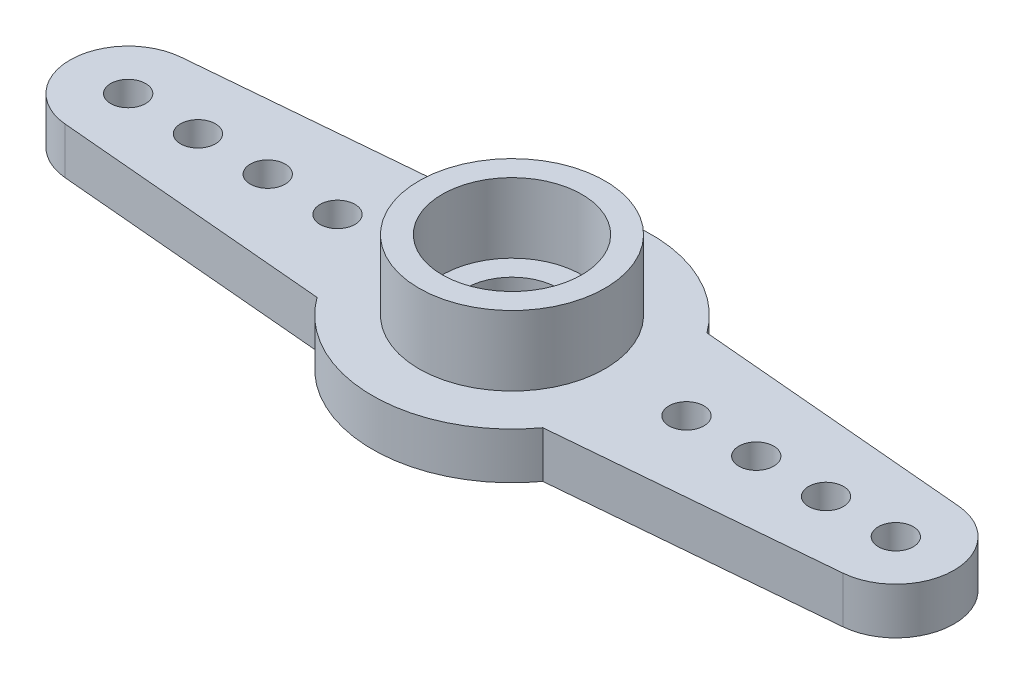
ISO-10303-21;
HEADER;
FILE_DESCRIPTION(('STEP AP214'),'2;1');
FILE_NAME('part.step','',(''),(''),'','','');
FILE_SCHEMA(('AUTOMOTIVE_DESIGN { 1 0 10303 214 1 1 1 1 }'));
ENDSEC;
DATA;
#1=APPLICATION_CONTEXT('core data for automotive mechanical design processes');
#2=APPLICATION_PROTOCOL_DEFINITION('international standard','automotive_design',2000,#1);
#3=PRODUCT_CONTEXT('',#1,'mechanical');
#4=PRODUCT('Part','Part','',(#3));
#5=PRODUCT_RELATED_PRODUCT_CATEGORY('part','',(#4));
#6=PRODUCT_DEFINITION_FORMATION('','',#4);
#7=PRODUCT_DEFINITION_CONTEXT('part definition',#1,'design');
#8=PRODUCT_DEFINITION('design','',#6,#7);
#9=PRODUCT_DEFINITION_SHAPE('','',#8);
#10=(LENGTH_UNIT() NAMED_UNIT(*) SI_UNIT(.MILLI.,.METRE.));
#11=(NAMED_UNIT(*) PLANE_ANGLE_UNIT() SI_UNIT($,.RADIAN.));
#12=(NAMED_UNIT(*) SI_UNIT($,.STERADIAN.) SOLID_ANGLE_UNIT());
#13=UNCERTAINTY_MEASURE_WITH_UNIT(LENGTH_MEASURE(1.E-05),#10,'distance_accuracy_value','');
#14=(GEOMETRIC_REPRESENTATION_CONTEXT(3) GLOBAL_UNCERTAINTY_ASSIGNED_CONTEXT((#13)) GLOBAL_UNIT_ASSIGNED_CONTEXT((#10,
#11,#12)) REPRESENTATION_CONTEXT('',''));
#15=CARTESIAN_POINT('',(0.,0.,0.));
#16=DIRECTION('',(0.,0.,1.));
#17=DIRECTION('',(1.,0.,0.));
#18=AXIS2_PLACEMENT_3D('',#15,#16,#17);
#19=CARTESIAN_POINT('',(16.5,2.,0.));
#20=DIRECTION('',(0.,1.,0.));
#21=DIRECTION('',(0.,0.,1.));
#22=AXIS2_PLACEMENT_3D('',#19,#20,#21);
#23=PLANE('',#22);
#24=CARTESIAN_POINT('',(0.,2.,0.));
#25=DIRECTION('',(0.,1.,0.));
#26=DIRECTION('',(0.,0.,1.));
#27=AXIS2_PLACEMENT_3D('',#24,#25,#26);
#28=CIRCLE('',#27,2.);
#29=CARTESIAN_POINT('',(0.,2.,2.));
#30=VERTEX_POINT('',#29);
#31=EDGE_CURVE('E142',#30,#30,#28,.T.);
#32=ORIENTED_EDGE('',*,*,#31,.F.);
#33=EDGE_LOOP('',(#32));
#34=FACE_BOUND('',#33,.T.);
#35=CARTESIAN_POINT('',(0.,2.,0.));
#36=DIRECTION('',(0.,1.,0.));
#37=DIRECTION('',(0.,0.,1.));
#38=AXIS2_PLACEMENT_3D('',#35,#36,#37);
#39=CIRCLE('',#38,3.);
#40=CARTESIAN_POINT('',(0.,2.,3.));
#41=VERTEX_POINT('',#40);
#42=EDGE_CURVE('E11',#41,#41,#39,.F.);
#43=ORIENTED_EDGE('',*,*,#42,.F.);
#44=EDGE_LOOP('',(#43));
#45=FACE_BOUND('',#44,.T.);
#46=ADVANCED_FACE('F39',(#34,#45),#23,.T.);
#47=CARTESIAN_POINT('',(0.,2.,0.));
#48=DIRECTION('',(0.,1.,0.));
#49=DIRECTION('',(0.,0.,1.));
#50=AXIS2_PLACEMENT_3D('',#47,#48,#49);
#51=CIRCLE('',#50,4.);
#52=CARTESIAN_POINT('',(0.,2.,4.));
#53=VERTEX_POINT('',#52);
#54=EDGE_CURVE('E245',#53,#53,#51,.T.);
#55=ORIENTED_EDGE('',*,*,#54,.F.);
#56=EDGE_LOOP('',(#55));
#57=FACE_BOUND('',#56,.T.);
#58=CARTESIAN_POINT('',(-10.5,2.,0.));
#59=DIRECTION('',(0.,1.,0.));
#60=DIRECTION('',(0.,0.,-1.));
#61=AXIS2_PLACEMENT_3D('',#58,#59,#60);
#62=CIRCLE('',#61,0.75);
#63=CARTESIAN_POINT('',(-10.5,2.,-0.75));
#64=VERTEX_POINT('',#63);
#65=EDGE_CURVE('E230',#64,#64,#62,.T.);
#66=ORIENTED_EDGE('',*,*,#65,.F.);
#67=EDGE_LOOP('',(#66));
#68=FACE_BOUND('',#67,.T.);
#69=CARTESIAN_POINT('',(-16.5,2.,0.));
#70=DIRECTION('',(0.,1.,0.));
#71=DIRECTION('',(0.,0.,-1.));
#72=AXIS2_PLACEMENT_3D('',#69,#70,#71);
#73=CIRCLE('',#72,0.750000000000002);
#74=CARTESIAN_POINT('',(-16.5,2.,-0.750000000000002));
#75=VERTEX_POINT('',#74);
#76=EDGE_CURVE('E218',#75,#75,#73,.T.);
#77=ORIENTED_EDGE('',*,*,#76,.F.);
#78=EDGE_LOOP('',(#77));
#79=FACE_BOUND('',#78,.T.);
#80=CARTESIAN_POINT('',(13.5,2.,0.));
#81=DIRECTION('',(0.,1.,0.));
#82=DIRECTION('',(0.,0.,1.));
#83=AXIS2_PLACEMENT_3D('',#80,#81,#82);
#84=CIRCLE('',#83,0.750000000000002);
#85=CARTESIAN_POINT('',(13.5,2.,0.750000000000002));
#86=VERTEX_POINT('',#85);
#87=EDGE_CURVE('E206',#86,#86,#84,.T.);
#88=ORIENTED_EDGE('',*,*,#87,.F.);
#89=EDGE_LOOP('',(#88));
#90=FACE_BOUND('',#89,.T.);
#91=CARTESIAN_POINT('',(7.5,2.,0.));
#92=DIRECTION('',(0.,1.,0.));
#93=DIRECTION('',(0.,0.,1.));
#94=AXIS2_PLACEMENT_3D('',#91,#92,#93);
#95=CIRCLE('',#94,0.75);
#96=CARTESIAN_POINT('',(7.5,2.,0.75));
#97=VERTEX_POINT('',#96);
#98=EDGE_CURVE('E194',#97,#97,#95,.T.);
#99=ORIENTED_EDGE('',*,*,#98,.F.);
#100=EDGE_LOOP('',(#99));
#101=FACE_BOUND('',#100,.T.);
#102=CARTESIAN_POINT('',(16.5,2.,0.));
#103=DIRECTION('',(0.,1.,0.));
#104=DIRECTION('',(0.,0.,1.));
#105=AXIS2_PLACEMENT_3D('',#102,#103,#104);
#106=CIRCLE('',#105,2.5);
#107=CARTESIAN_POINT('',(16.7178893568691,2.,2.49048674522937));
#108=VERTEX_POINT('',#107);
#109=CARTESIAN_POINT('',(16.7178893568691,2.,-2.49048674522936));
#110=VERTEX_POINT('',#109);
#111=EDGE_CURVE('E153',#108,#110,#106,.T.);
#112=ORIENTED_EDGE('',*,*,#111,.T.);
#113=DIRECTION('',(-0.996194698091746,0.,-0.0871557427476513));
#114=VECTOR('',#113,1.);
#115=CARTESIAN_POINT('',(16.7178893568691,2.,-2.49048674522936));
#116=LINE('',#115,#114);
#117=CARTESIAN_POINT('',(4.85276526325977,2.,-3.5285505947484));
#118=VERTEX_POINT('',#117);
#119=EDGE_CURVE('E100',#110,#118,#116,.T.);
#120=ORIENTED_EDGE('',*,*,#119,.T.);
#121=CARTESIAN_POINT('',(0.,2.,0.));
#122=DIRECTION('',(0.,1.,0.));
#123=DIRECTION('',(0.,0.,1.));
#124=AXIS2_PLACEMENT_3D('',#121,#122,#123);
#125=CIRCLE('',#124,6.);
#126=CARTESIAN_POINT('',(-4.85276526325977,2.,-3.5285505947484));
#127=VERTEX_POINT('',#126);
#128=EDGE_CURVE('E185',#118,#127,#125,.T.);
#129=ORIENTED_EDGE('',*,*,#128,.T.);
#130=DIRECTION('',(-0.996194698091746,0.,0.0871557427476513));
#131=VECTOR('',#130,1.);
#132=CARTESIAN_POINT('',(-16.7178893568691,2.,-2.49048674522936));
#133=LINE('',#132,#131);
#134=CARTESIAN_POINT('',(-16.7178893568691,2.,-2.49048674522936));
#135=VERTEX_POINT('',#134);
#136=EDGE_CURVE('E184',#127,#135,#133,.T.);
#137=ORIENTED_EDGE('',*,*,#136,.T.);
#138=CARTESIAN_POINT('',(-16.5,2.,0.));
#139=DIRECTION('',(0.,1.,0.));
#140=DIRECTION('',(0.,0.,-1.));
#141=AXIS2_PLACEMENT_3D('',#138,#139,#140);
#142=CIRCLE('',#141,2.5);
#143=CARTESIAN_POINT('',(-16.7178893568691,2.,2.49048674522937));
#144=VERTEX_POINT('',#143);
#145=EDGE_CURVE('E120',#135,#144,#142,.T.);
#146=ORIENTED_EDGE('',*,*,#145,.T.);
#147=DIRECTION('',(0.996194698091746,0.,0.0871557427476516));
#148=VECTOR('',#147,1.);
#149=CARTESIAN_POINT('',(-16.7178893568691,2.,2.49048674522937));
#150=LINE('',#149,#148);
#151=CARTESIAN_POINT('',(-4.85276526325977,2.,3.52855059474841));
#152=VERTEX_POINT('',#151);
#153=EDGE_CURVE('E113',#144,#152,#150,.T.);
#154=ORIENTED_EDGE('',*,*,#153,.T.);
#155=CARTESIAN_POINT('',(0.,2.,0.));
#156=DIRECTION('',(0.,1.,0.));
#157=DIRECTION('',(0.,0.,1.));
#158=AXIS2_PLACEMENT_3D('',#155,#156,#157);
#159=CIRCLE('',#158,6.);
#160=CARTESIAN_POINT('',(4.85276526325977,2.,3.52855059474841));
#161=VERTEX_POINT('',#160);
#162=EDGE_CURVE('E118',#152,#161,#159,.T.);
#163=ORIENTED_EDGE('',*,*,#162,.T.);
#164=DIRECTION('',(0.996194698091746,0.,-0.0871557427476516));
#165=VECTOR('',#164,1.);
#166=CARTESIAN_POINT('',(16.7178893568691,2.,2.49048674522937));
#167=LINE('',#166,#165);
#168=EDGE_CURVE('E56',#161,#108,#167,.T.);
#169=ORIENTED_EDGE('',*,*,#168,.T.);
#170=EDGE_LOOP('',(#112,#120,#129,#137,#146,#154,#163,#169));
#171=FACE_BOUND('',#170,.T.);
#172=CARTESIAN_POINT('',(10.5,2.,0.));
#173=DIRECTION('',(0.,1.,0.));
#174=DIRECTION('',(0.,0.,1.));
#175=AXIS2_PLACEMENT_3D('',#172,#173,#174);
#176=CIRCLE('',#175,0.75);
#177=CARTESIAN_POINT('',(10.5,2.,0.75));
#178=VERTEX_POINT('',#177);
#179=EDGE_CURVE('E200',#178,#178,#176,.T.);
#180=ORIENTED_EDGE('',*,*,#179,.F.);
#181=EDGE_LOOP('',(#180));
#182=FACE_BOUND('',#181,.T.);
#183=CARTESIAN_POINT('',(16.5,2.,0.));
#184=DIRECTION('',(0.,1.,0.));
#185=DIRECTION('',(0.,0.,1.));
#186=AXIS2_PLACEMENT_3D('',#183,#184,#185);
#187=CIRCLE('',#186,0.750000000000002);
#188=CARTESIAN_POINT('',(16.5,2.,0.750000000000002));
#189=VERTEX_POINT('',#188);
#190=EDGE_CURVE('E212',#189,#189,#187,.T.);
#191=ORIENTED_EDGE('',*,*,#190,.F.);
#192=EDGE_LOOP('',(#191));
#193=FACE_BOUND('',#192,.T.);
#194=CARTESIAN_POINT('',(-13.5,2.,0.));
#195=DIRECTION('',(0.,1.,0.));
#196=DIRECTION('',(0.,0.,-1.));
#197=AXIS2_PLACEMENT_3D('',#194,#195,#196);
#198=CIRCLE('',#197,0.750000000000002);
#199=CARTESIAN_POINT('',(-13.5,2.,-0.750000000000002));
#200=VERTEX_POINT('',#199);
#201=EDGE_CURVE('E224',#200,#200,#198,.T.);
#202=ORIENTED_EDGE('',*,*,#201,.F.);
#203=EDGE_LOOP('',(#202));
#204=FACE_BOUND('',#203,.T.);
#205=CARTESIAN_POINT('',(-7.5,2.,0.));
#206=DIRECTION('',(0.,1.,0.));
#207=DIRECTION('',(0.,0.,-1.));
#208=AXIS2_PLACEMENT_3D('',#205,#206,#207);
#209=CIRCLE('',#208,0.75);
#210=CARTESIAN_POINT('',(-7.5,2.,-0.75));
#211=VERTEX_POINT('',#210);
#212=EDGE_CURVE('E236',#211,#211,#209,.T.);
#213=ORIENTED_EDGE('',*,*,#212,.F.);
#214=EDGE_LOOP('',(#213));
#215=FACE_BOUND('',#214,.T.);
#216=ADVANCED_FACE('F115',(#57,#68,#79,#90,#101,#171,#182,#193,#204,#215),#23,.T.);
#217=CARTESIAN_POINT('',(16.5,0.,0.));
#218=DIRECTION('',(0.,1.,0.));
#219=DIRECTION('',(0.,0.,1.));
#220=AXIS2_PLACEMENT_3D('',#217,#218,#219);
#221=PLANE('',#220);
#222=CARTESIAN_POINT('',(16.5,0.,0.));
#223=DIRECTION('',(0.,1.,0.));
#224=DIRECTION('',(0.,0.,1.));
#225=AXIS2_PLACEMENT_3D('',#222,#223,#224);
#226=CIRCLE('',#225,2.5);
#227=CARTESIAN_POINT('',(16.7178893568691,0.,2.49048674522937));
#228=VERTEX_POINT('',#227);
#229=CARTESIAN_POINT('',(16.7178893568691,0.,-2.49048674522936));
#230=VERTEX_POINT('',#229);
#231=EDGE_CURVE('E138',#228,#230,#226,.T.);
#232=ORIENTED_EDGE('',*,*,#231,.F.);
#233=DIRECTION('',(0.996194698091746,0.,-0.0871557427476516));
#234=VECTOR('',#233,1.);
#235=CARTESIAN_POINT('',(16.7178893568691,0.,2.49048674522937));
#236=LINE('',#235,#234);
#237=CARTESIAN_POINT('',(4.85276526325977,0.,3.52855059474841));
#238=VERTEX_POINT('',#237);
#239=EDGE_CURVE('E91',#238,#228,#236,.T.);
#240=ORIENTED_EDGE('',*,*,#239,.F.);
#241=CARTESIAN_POINT('',(0.,0.,0.));
#242=DIRECTION('',(0.,1.,0.));
#243=DIRECTION('',(0.,0.,1.));
#244=AXIS2_PLACEMENT_3D('',#241,#242,#243);
#245=CIRCLE('',#244,6.);
#246=CARTESIAN_POINT('',(-4.85276526325977,0.,3.52855059474841));
#247=VERTEX_POINT('',#246);
#248=EDGE_CURVE('E85',#247,#238,#245,.T.);
#249=ORIENTED_EDGE('',*,*,#248,.F.);
#250=DIRECTION('',(0.996194698091746,0.,0.0871557427476516));
#251=VECTOR('',#250,1.);
#252=CARTESIAN_POINT('',(-16.7178893568691,0.,2.49048674522937));
#253=LINE('',#252,#251);
#254=CARTESIAN_POINT('',(-16.7178893568691,0.,2.49048674522937));
#255=VERTEX_POINT('',#254);
#256=EDGE_CURVE('E128',#255,#247,#253,.T.);
#257=ORIENTED_EDGE('',*,*,#256,.F.);
#258=CARTESIAN_POINT('',(-16.5,0.,0.));
#259=DIRECTION('',(0.,1.,0.));
#260=DIRECTION('',(0.,0.,-1.));
#261=AXIS2_PLACEMENT_3D('',#258,#259,#260);
#262=CIRCLE('',#261,2.5);
#263=CARTESIAN_POINT('',(-16.7178893568691,0.,-2.49048674522936));
#264=VERTEX_POINT('',#263);
#265=EDGE_CURVE('E148',#264,#255,#262,.T.);
#266=ORIENTED_EDGE('',*,*,#265,.F.);
#267=DIRECTION('',(-0.996194698091746,0.,0.0871557427476513));
#268=VECTOR('',#267,1.);
#269=CARTESIAN_POINT('',(-16.7178893568691,0.,-2.49048674522936));
#270=LINE('',#269,#268);
#271=CARTESIAN_POINT('',(-4.85276526325977,0.,-3.5285505947484));
#272=VERTEX_POINT('',#271);
#273=EDGE_CURVE('E146',#272,#264,#270,.T.);
#274=ORIENTED_EDGE('',*,*,#273,.F.);
#275=CARTESIAN_POINT('',(0.,0.,0.));
#276=DIRECTION('',(0.,1.,0.));
#277=DIRECTION('',(0.,0.,1.));
#278=AXIS2_PLACEMENT_3D('',#275,#276,#277);
#279=CIRCLE('',#278,6.);
#280=CARTESIAN_POINT('',(4.85276526325977,0.,-3.5285505947484));
#281=VERTEX_POINT('',#280);
#282=EDGE_CURVE('E144',#281,#272,#279,.T.);
#283=ORIENTED_EDGE('',*,*,#282,.F.);
#284=DIRECTION('',(-0.996194698091746,0.,-0.0871557427476513));
#285=VECTOR('',#284,1.);
#286=CARTESIAN_POINT('',(16.7178893568691,0.,-2.49048674522936));
#287=LINE('',#286,#285);
#288=EDGE_CURVE('E141',#230,#281,#287,.T.);
#289=ORIENTED_EDGE('',*,*,#288,.F.);
#290=EDGE_LOOP('',(#232,#240,#249,#257,#266,#274,#283,#289));
#291=FACE_BOUND('',#290,.T.);
#292=CARTESIAN_POINT('',(0.,0.,0.));
#293=DIRECTION('',(0.,1.,0.));
#294=DIRECTION('',(0.,0.,1.));
#295=AXIS2_PLACEMENT_3D('',#292,#293,#294);
#296=CIRCLE('',#295,2.);
#297=CARTESIAN_POINT('',(0.,0.,2.));
#298=VERTEX_POINT('',#297);
#299=EDGE_CURVE('E191',#298,#298,#296,.T.);
#300=ORIENTED_EDGE('',*,*,#299,.T.);
#301=EDGE_LOOP('',(#300));
#302=FACE_BOUND('',#301,.T.);
#303=CARTESIAN_POINT('',(7.5,0.,0.));
#304=DIRECTION('',(0.,1.,0.));
#305=DIRECTION('',(0.,0.,1.));
#306=AXIS2_PLACEMENT_3D('',#303,#304,#305);
#307=CIRCLE('',#306,0.75);
#308=CARTESIAN_POINT('',(7.5,0.,0.75));
#309=VERTEX_POINT('',#308);
#310=EDGE_CURVE('E197',#309,#309,#307,.T.);
#311=ORIENTED_EDGE('',*,*,#310,.T.);
#312=EDGE_LOOP('',(#311));
#313=FACE_BOUND('',#312,.T.);
#314=CARTESIAN_POINT('',(10.5,0.,0.));
#315=DIRECTION('',(0.,1.,0.));
#316=DIRECTION('',(0.,0.,1.));
#317=AXIS2_PLACEMENT_3D('',#314,#315,#316);
#318=CIRCLE('',#317,0.75);
#319=CARTESIAN_POINT('',(10.5,0.,0.75));
#320=VERTEX_POINT('',#319);
#321=EDGE_CURVE('E203',#320,#320,#318,.T.);
#322=ORIENTED_EDGE('',*,*,#321,.T.);
#323=EDGE_LOOP('',(#322));
#324=FACE_BOUND('',#323,.T.);
#325=CARTESIAN_POINT('',(13.5,0.,0.));
#326=DIRECTION('',(0.,1.,0.));
#327=DIRECTION('',(0.,0.,1.));
#328=AXIS2_PLACEMENT_3D('',#325,#326,#327);
#329=CIRCLE('',#328,0.750000000000002);
#330=CARTESIAN_POINT('',(13.5,0.,0.750000000000002));
#331=VERTEX_POINT('',#330);
#332=EDGE_CURVE('E209',#331,#331,#329,.T.);
#333=ORIENTED_EDGE('',*,*,#332,.T.);
#334=EDGE_LOOP('',(#333));
#335=FACE_BOUND('',#334,.T.);
#336=CARTESIAN_POINT('',(16.5,0.,0.));
#337=DIRECTION('',(0.,1.,0.));
#338=DIRECTION('',(0.,0.,1.));
#339=AXIS2_PLACEMENT_3D('',#336,#337,#338);
#340=CIRCLE('',#339,0.750000000000002);
#341=CARTESIAN_POINT('',(16.5,0.,0.750000000000002));
#342=VERTEX_POINT('',#341);
#343=EDGE_CURVE('E215',#342,#342,#340,.T.);
#344=ORIENTED_EDGE('',*,*,#343,.T.);
#345=EDGE_LOOP('',(#344));
#346=FACE_BOUND('',#345,.T.);
#347=CARTESIAN_POINT('',(-16.5,0.,0.));
#348=DIRECTION('',(0.,1.,0.));
#349=DIRECTION('',(0.,0.,-1.));
#350=AXIS2_PLACEMENT_3D('',#347,#348,#349);
#351=CIRCLE('',#350,0.750000000000002);
#352=CARTESIAN_POINT('',(-16.5,0.,-0.750000000000002));
#353=VERTEX_POINT('',#352);
#354=EDGE_CURVE('E221',#353,#353,#351,.T.);
#355=ORIENTED_EDGE('',*,*,#354,.T.);
#356=EDGE_LOOP('',(#355));
#357=FACE_BOUND('',#356,.T.);
#358=CARTESIAN_POINT('',(-13.5,0.,0.));
#359=DIRECTION('',(0.,1.,0.));
#360=DIRECTION('',(0.,0.,-1.));
#361=AXIS2_PLACEMENT_3D('',#358,#359,#360);
#362=CIRCLE('',#361,0.750000000000002);
#363=CARTESIAN_POINT('',(-13.5,0.,-0.750000000000002));
#364=VERTEX_POINT('',#363);
#365=EDGE_CURVE('E227',#364,#364,#362,.T.);
#366=ORIENTED_EDGE('',*,*,#365,.T.);
#367=EDGE_LOOP('',(#366));
#368=FACE_BOUND('',#367,.T.);
#369=CARTESIAN_POINT('',(-10.5,0.,0.));
#370=DIRECTION('',(0.,1.,0.));
#371=DIRECTION('',(0.,0.,-1.));
#372=AXIS2_PLACEMENT_3D('',#369,#370,#371);
#373=CIRCLE('',#372,0.75);
#374=CARTESIAN_POINT('',(-10.5,0.,-0.75));
#375=VERTEX_POINT('',#374);
#376=EDGE_CURVE('E233',#375,#375,#373,.T.);
#377=ORIENTED_EDGE('',*,*,#376,.T.);
#378=EDGE_LOOP('',(#377));
#379=FACE_BOUND('',#378,.T.);
#380=CARTESIAN_POINT('',(-7.5,0.,0.));
#381=DIRECTION('',(0.,1.,0.));
#382=DIRECTION('',(0.,0.,-1.));
#383=AXIS2_PLACEMENT_3D('',#380,#381,#382);
#384=CIRCLE('',#383,0.75);
#385=CARTESIAN_POINT('',(-7.5,0.,-0.75));
#386=VERTEX_POINT('',#385);
#387=EDGE_CURVE('E239',#386,#386,#384,.T.);
#388=ORIENTED_EDGE('',*,*,#387,.T.);
#389=EDGE_LOOP('',(#388));
#390=FACE_BOUND('',#389,.T.);
#391=ADVANCED_FACE('F171',(#291,#302,#313,#324,#335,#346,#357,#368,#379,#390),#221,.F.);
#392=CARTESIAN_POINT('',(16.5,2.,0.));
#393=DIRECTION('',(0.,-1.,0.));
#394=DIRECTION('',(0.,0.,-1.));
#395=AXIS2_PLACEMENT_3D('',#392,#393,#394);
#396=CYLINDRICAL_SURFACE('',#395,2.5);
#397=ORIENTED_EDGE('',*,*,#231,.T.);
#398=DIRECTION('',(0.,-1.,0.));
#399=VECTOR('',#398,1.);
#400=CARTESIAN_POINT('',(16.7178893568691,2.,-2.49048674522936));
#401=LINE('',#400,#399);
#402=EDGE_CURVE('E48',#110,#230,#401,.T.);
#403=ORIENTED_EDGE('',*,*,#402,.F.);
#404=ORIENTED_EDGE('',*,*,#111,.F.);
#405=DIRECTION('',(0.,-1.,0.));
#406=VECTOR('',#405,1.);
#407=CARTESIAN_POINT('',(16.7178893568691,2.,2.49048674522937));
#408=LINE('',#407,#406);
#409=EDGE_CURVE('E134',#108,#228,#408,.T.);
#410=ORIENTED_EDGE('',*,*,#409,.T.);
#411=EDGE_LOOP('',(#397,#403,#404,#410));
#412=FACE_BOUND('',#411,.T.);
#413=ADVANCED_FACE('F41',(#412),#396,.T.);
#414=CARTESIAN_POINT('',(16.7178893568691,2.,-2.49048674522936));
#415=DIRECTION('',(-0.0871557427476513,0.,0.996194698091746));
#416=DIRECTION('',(0.996194698091746,0.,0.0871557427476513));
#417=AXIS2_PLACEMENT_3D('',#414,#415,#416);
#418=PLANE('',#417);
#419=ORIENTED_EDGE('',*,*,#288,.T.);
#420=DIRECTION('',(0.,-1.,0.));
#421=VECTOR('',#420,1.);
#422=CARTESIAN_POINT('',(4.85276526325977,2.,-3.5285505947484));
#423=LINE('',#422,#421);
#424=EDGE_CURVE('E163',#118,#281,#423,.T.);
#425=ORIENTED_EDGE('',*,*,#424,.F.);
#426=ORIENTED_EDGE('',*,*,#119,.F.);
#427=ORIENTED_EDGE('',*,*,#402,.T.);
#428=EDGE_LOOP('',(#419,#425,#426,#427));
#429=FACE_BOUND('',#428,.T.);
#430=ADVANCED_FACE('F166',(#429),#418,.F.);
#431=CARTESIAN_POINT('',(0.,2.,0.));
#432=DIRECTION('',(0.,-1.,0.));
#433=DIRECTION('',(0.,0.,-1.));
#434=AXIS2_PLACEMENT_3D('',#431,#432,#433);
#435=CYLINDRICAL_SURFACE('',#434,6.);
#436=ORIENTED_EDGE('',*,*,#282,.T.);
#437=DIRECTION('',(0.,-1.,0.));
#438=VECTOR('',#437,1.);
#439=CARTESIAN_POINT('',(-4.85276526325977,2.,-3.5285505947484));
#440=LINE('',#439,#438);
#441=EDGE_CURVE('E160',#127,#272,#440,.T.);
#442=ORIENTED_EDGE('',*,*,#441,.F.);
#443=ORIENTED_EDGE('',*,*,#128,.F.);
#444=ORIENTED_EDGE('',*,*,#424,.T.);
#445=EDGE_LOOP('',(#436,#442,#443,#444));
#446=FACE_BOUND('',#445,.T.);
#447=ADVANCED_FACE('F178',(#446),#435,.T.);
#448=CARTESIAN_POINT('',(-16.7178893568691,2.,-2.49048674522936));
#449=DIRECTION('',(0.0871557427476513,0.,0.996194698091746));
#450=DIRECTION('',(0.996194698091746,0.,-0.0871557427476513));
#451=AXIS2_PLACEMENT_3D('',#448,#449,#450);
#452=PLANE('',#451);
#453=ORIENTED_EDGE('',*,*,#273,.T.);
#454=DIRECTION('',(0.,-1.,0.));
#455=VECTOR('',#454,1.);
#456=CARTESIAN_POINT('',(-16.7178893568691,2.,-2.49048674522936));
#457=LINE('',#456,#455);
#458=EDGE_CURVE('E157',#135,#264,#457,.T.);
#459=ORIENTED_EDGE('',*,*,#458,.F.);
#460=ORIENTED_EDGE('',*,*,#136,.F.);
#461=ORIENTED_EDGE('',*,*,#441,.T.);
#462=EDGE_LOOP('',(#453,#459,#460,#461));
#463=FACE_BOUND('',#462,.T.);
#464=ADVANCED_FACE('F182',(#463),#452,.F.);
#465=CARTESIAN_POINT('',(-16.5,2.,0.));
#466=DIRECTION('',(0.,-1.,0.));
#467=DIRECTION('',(0.,0.,-1.));
#468=AXIS2_PLACEMENT_3D('',#465,#466,#467);
#469=CYLINDRICAL_SURFACE('',#468,2.5);
#470=ORIENTED_EDGE('',*,*,#265,.T.);
#471=DIRECTION('',(0.,-1.,0.));
#472=VECTOR('',#471,1.);
#473=CARTESIAN_POINT('',(-16.7178893568691,2.,2.49048674522937));
#474=LINE('',#473,#472);
#475=EDGE_CURVE('E129',#144,#255,#474,.T.);
#476=ORIENTED_EDGE('',*,*,#475,.F.);
#477=ORIENTED_EDGE('',*,*,#145,.F.);
#478=ORIENTED_EDGE('',*,*,#458,.T.);
#479=EDGE_LOOP('',(#470,#476,#477,#478));
#480=FACE_BOUND('',#479,.T.);
#481=ADVANCED_FACE('F295',(#480),#469,.T.);
#482=CARTESIAN_POINT('',(-16.7178893568691,2.,2.49048674522937));
#483=DIRECTION('',(0.0871557427476516,0.,-0.996194698091746));
#484=DIRECTION('',(-0.996194698091746,0.,-0.0871557427476516));
#485=AXIS2_PLACEMENT_3D('',#482,#483,#484);
#486=PLANE('',#485);
#487=ORIENTED_EDGE('',*,*,#256,.T.);
#488=DIRECTION('',(0.,-1.,0.));
#489=VECTOR('',#488,1.);
#490=CARTESIAN_POINT('',(-4.85276526325977,2.,3.52855059474841));
#491=LINE('',#490,#489);
#492=EDGE_CURVE('E125',#152,#247,#491,.T.);
#493=ORIENTED_EDGE('',*,*,#492,.F.);
#494=ORIENTED_EDGE('',*,*,#153,.F.);
#495=ORIENTED_EDGE('',*,*,#475,.T.);
#496=EDGE_LOOP('',(#487,#493,#494,#495));
#497=FACE_BOUND('',#496,.T.);
#498=ADVANCED_FACE('F126',(#497),#486,.F.);
#499=CARTESIAN_POINT('',(0.,2.,0.));
#500=DIRECTION('',(0.,-1.,0.));
#501=DIRECTION('',(0.,0.,-1.));
#502=AXIS2_PLACEMENT_3D('',#499,#500,#501);
#503=CYLINDRICAL_SURFACE('',#502,6.);
#504=ORIENTED_EDGE('',*,*,#248,.T.);
#505=DIRECTION('',(0.,-1.,0.));
#506=VECTOR('',#505,1.);
#507=CARTESIAN_POINT('',(4.85276526325977,2.,3.52855059474841));
#508=LINE('',#507,#506);
#509=EDGE_CURVE('E130',#161,#238,#508,.T.);
#510=ORIENTED_EDGE('',*,*,#509,.F.);
#511=ORIENTED_EDGE('',*,*,#162,.F.);
#512=ORIENTED_EDGE('',*,*,#492,.T.);
#513=EDGE_LOOP('',(#504,#510,#511,#512));
#514=FACE_BOUND('',#513,.T.);
#515=ADVANCED_FACE('F132',(#514),#503,.T.);
#516=CARTESIAN_POINT('',(16.7178893568691,2.,2.49048674522937));
#517=DIRECTION('',(-0.0871557427476516,0.,-0.996194698091746));
#518=DIRECTION('',(-0.996194698091746,0.,0.0871557427476516));
#519=AXIS2_PLACEMENT_3D('',#516,#517,#518);
#520=PLANE('',#519);
#521=ORIENTED_EDGE('',*,*,#239,.T.);
#522=ORIENTED_EDGE('',*,*,#409,.F.);
#523=ORIENTED_EDGE('',*,*,#168,.F.);
#524=ORIENTED_EDGE('',*,*,#509,.T.);
#525=EDGE_LOOP('',(#521,#522,#523,#524));
#526=FACE_BOUND('',#525,.T.);
#527=ADVANCED_FACE('F288',(#526),#520,.F.);
#528=CARTESIAN_POINT('',(0.,2.,0.));
#529=DIRECTION('',(0.,-1.,0.));
#530=DIRECTION('',(0.,0.,-1.));
#531=AXIS2_PLACEMENT_3D('',#528,#529,#530);
#532=CYLINDRICAL_SURFACE('',#531,2.);
#533=ORIENTED_EDGE('',*,*,#31,.T.);
#534=EDGE_LOOP('',(#533));
#535=FACE_BOUND('',#534,.T.);
#536=ORIENTED_EDGE('',*,*,#299,.F.);
#537=EDGE_LOOP('',(#536));
#538=FACE_BOUND('',#537,.T.);
#539=ADVANCED_FACE('F284',(#535,#538),#532,.F.);
#540=CARTESIAN_POINT('',(7.5,2.,0.));
#541=DIRECTION('',(0.,-1.,0.));
#542=DIRECTION('',(0.,0.,-1.));
#543=AXIS2_PLACEMENT_3D('',#540,#541,#542);
#544=CYLINDRICAL_SURFACE('',#543,0.75);
#545=ORIENTED_EDGE('',*,*,#98,.T.);
#546=EDGE_LOOP('',(#545));
#547=FACE_BOUND('',#546,.T.);
#548=ORIENTED_EDGE('',*,*,#310,.F.);
#549=EDGE_LOOP('',(#548));
#550=FACE_BOUND('',#549,.T.);
#551=ADVANCED_FACE('F363',(#547,#550),#544,.F.);
#552=CARTESIAN_POINT('',(10.5,2.,0.));
#553=DIRECTION('',(0.,-1.,0.));
#554=DIRECTION('',(0.,0.,-1.));
#555=AXIS2_PLACEMENT_3D('',#552,#553,#554);
#556=CYLINDRICAL_SURFACE('',#555,0.75);
#557=ORIENTED_EDGE('',*,*,#179,.T.);
#558=EDGE_LOOP('',(#557));
#559=FACE_BOUND('',#558,.T.);
#560=ORIENTED_EDGE('',*,*,#321,.F.);
#561=EDGE_LOOP('',(#560));
#562=FACE_BOUND('',#561,.T.);
#563=ADVANCED_FACE('F371',(#559,#562),#556,.F.);
#564=CARTESIAN_POINT('',(13.5,2.,0.));
#565=DIRECTION('',(0.,-1.,0.));
#566=DIRECTION('',(0.,0.,-1.));
#567=AXIS2_PLACEMENT_3D('',#564,#565,#566);
#568=CYLINDRICAL_SURFACE('',#567,0.750000000000002);
#569=ORIENTED_EDGE('',*,*,#87,.T.);
#570=EDGE_LOOP('',(#569));
#571=FACE_BOUND('',#570,.T.);
#572=ORIENTED_EDGE('',*,*,#332,.F.);
#573=EDGE_LOOP('',(#572));
#574=FACE_BOUND('',#573,.T.);
#575=ADVANCED_FACE('F379',(#571,#574),#568,.F.);
#576=CARTESIAN_POINT('',(16.5,2.,0.));
#577=DIRECTION('',(0.,-1.,0.));
#578=DIRECTION('',(0.,0.,-1.));
#579=AXIS2_PLACEMENT_3D('',#576,#577,#578);
#580=CYLINDRICAL_SURFACE('',#579,0.750000000000002);
#581=ORIENTED_EDGE('',*,*,#190,.T.);
#582=EDGE_LOOP('',(#581));
#583=FACE_BOUND('',#582,.T.);
#584=ORIENTED_EDGE('',*,*,#343,.F.);
#585=EDGE_LOOP('',(#584));
#586=FACE_BOUND('',#585,.T.);
#587=ADVANCED_FACE('F388',(#583,#586),#580,.F.);
#588=CARTESIAN_POINT('',(-16.5,2.,0.));
#589=DIRECTION('',(0.,-1.,0.));
#590=DIRECTION('',(0.,0.,-1.));
#591=AXIS2_PLACEMENT_3D('',#588,#589,#590);
#592=CYLINDRICAL_SURFACE('',#591,0.750000000000002);
#593=ORIENTED_EDGE('',*,*,#76,.T.);
#594=EDGE_LOOP('',(#593));
#595=FACE_BOUND('',#594,.T.);
#596=ORIENTED_EDGE('',*,*,#354,.F.);
#597=EDGE_LOOP('',(#596));
#598=FACE_BOUND('',#597,.T.);
#599=ADVANCED_FACE('F397',(#595,#598),#592,.F.);
#600=CARTESIAN_POINT('',(-13.5,2.,0.));
#601=DIRECTION('',(0.,-1.,0.));
#602=DIRECTION('',(0.,0.,-1.));
#603=AXIS2_PLACEMENT_3D('',#600,#601,#602);
#604=CYLINDRICAL_SURFACE('',#603,0.750000000000002);
#605=ORIENTED_EDGE('',*,*,#201,.T.);
#606=EDGE_LOOP('',(#605));
#607=FACE_BOUND('',#606,.T.);
#608=ORIENTED_EDGE('',*,*,#365,.F.);
#609=EDGE_LOOP('',(#608));
#610=FACE_BOUND('',#609,.T.);
#611=ADVANCED_FACE('F406',(#607,#610),#604,.F.);
#612=CARTESIAN_POINT('',(-10.5,2.,0.));
#613=DIRECTION('',(0.,-1.,0.));
#614=DIRECTION('',(0.,0.,-1.));
#615=AXIS2_PLACEMENT_3D('',#612,#613,#614);
#616=CYLINDRICAL_SURFACE('',#615,0.75);
#617=ORIENTED_EDGE('',*,*,#65,.T.);
#618=EDGE_LOOP('',(#617));
#619=FACE_BOUND('',#618,.T.);
#620=ORIENTED_EDGE('',*,*,#376,.F.);
#621=EDGE_LOOP('',(#620));
#622=FACE_BOUND('',#621,.T.);
#623=ADVANCED_FACE('F270',(#619,#622),#616,.F.);
#624=CARTESIAN_POINT('',(-7.5,2.,0.));
#625=DIRECTION('',(0.,-1.,0.));
#626=DIRECTION('',(0.,0.,-1.));
#627=AXIS2_PLACEMENT_3D('',#624,#625,#626);
#628=CYLINDRICAL_SURFACE('',#627,0.75);
#629=ORIENTED_EDGE('',*,*,#212,.T.);
#630=EDGE_LOOP('',(#629));
#631=FACE_BOUND('',#630,.T.);
#632=ORIENTED_EDGE('',*,*,#387,.F.);
#633=EDGE_LOOP('',(#632));
#634=FACE_BOUND('',#633,.T.);
#635=ADVANCED_FACE('F260',(#631,#634),#628,.F.);
#636=CARTESIAN_POINT('',(0.,5.,0.));
#637=DIRECTION('',(0.,1.,0.));
#638=DIRECTION('',(0.,0.,1.));
#639=AXIS2_PLACEMENT_3D('',#636,#637,#638);
#640=PLANE('',#639);
#641=CARTESIAN_POINT('',(0.,5.,0.));
#642=DIRECTION('',(0.,1.,0.));
#643=DIRECTION('',(0.,0.,1.));
#644=AXIS2_PLACEMENT_3D('',#641,#642,#643);
#645=CIRCLE('',#644,4.);
#646=CARTESIAN_POINT('',(0.,5.,4.));
#647=VERTEX_POINT('',#646);
#648=EDGE_CURVE('E242',#647,#647,#645,.T.);
#649=ORIENTED_EDGE('',*,*,#648,.T.);
#650=EDGE_LOOP('',(#649));
#651=FACE_BOUND('',#650,.T.);
#652=CARTESIAN_POINT('',(0.,5.,0.));
#653=DIRECTION('',(0.,1.,0.));
#654=DIRECTION('',(0.,0.,1.));
#655=AXIS2_PLACEMENT_3D('',#652,#653,#654);
#656=CIRCLE('',#655,3.);
#657=CARTESIAN_POINT('',(0.,5.,3.));
#658=VERTEX_POINT('',#657);
#659=EDGE_CURVE('E248',#658,#658,#656,.T.);
#660=ORIENTED_EDGE('',*,*,#659,.F.);
#661=EDGE_LOOP('',(#660));
#662=FACE_BOUND('',#661,.T.);
#663=ADVANCED_FACE('F257',(#651,#662),#640,.T.);
#664=CARTESIAN_POINT('',(0.,5.,0.));
#665=DIRECTION('',(0.,-1.,0.));
#666=DIRECTION('',(0.,0.,-1.));
#667=AXIS2_PLACEMENT_3D('',#664,#665,#666);
#668=CYLINDRICAL_SURFACE('',#667,4.);
#669=ORIENTED_EDGE('',*,*,#648,.F.);
#670=EDGE_LOOP('',(#669));
#671=FACE_BOUND('',#670,.T.);
#672=ORIENTED_EDGE('',*,*,#54,.T.);
#673=EDGE_LOOP('',(#672));
#674=FACE_BOUND('',#673,.T.);
#675=ADVANCED_FACE('F259',(#671,#674),#668,.T.);
#676=CARTESIAN_POINT('',(0.,5.,0.));
#677=DIRECTION('',(0.,-1.,0.));
#678=DIRECTION('',(0.,0.,-1.));
#679=AXIS2_PLACEMENT_3D('',#676,#677,#678);
#680=CYLINDRICAL_SURFACE('',#679,3.);
#681=ORIENTED_EDGE('',*,*,#659,.T.);
#682=EDGE_LOOP('',(#681));
#683=FACE_BOUND('',#682,.T.);
#684=ORIENTED_EDGE('',*,*,#42,.T.);
#685=EDGE_LOOP('',(#684));
#686=FACE_BOUND('',#685,.T.);
#687=ADVANCED_FACE('F254',(#683,#686),#680,.F.);
#688=CLOSED_SHELL('',(#46,#216,#391,#413,#430,#447,#464,#481,#498,#515,#527,#539,#551,#563,#575,
#587,#599,#611,#623,#635,#663,#675,#687));
#689=MANIFOLD_SOLID_BREP('B2',#688);
#690=ADVANCED_BREP_SHAPE_REPRESENTATION('',(#18,#689),#14);
#691=SHAPE_DEFINITION_REPRESENTATION(#9,#690);
ENDSEC;
END-ISO-10303-21;
